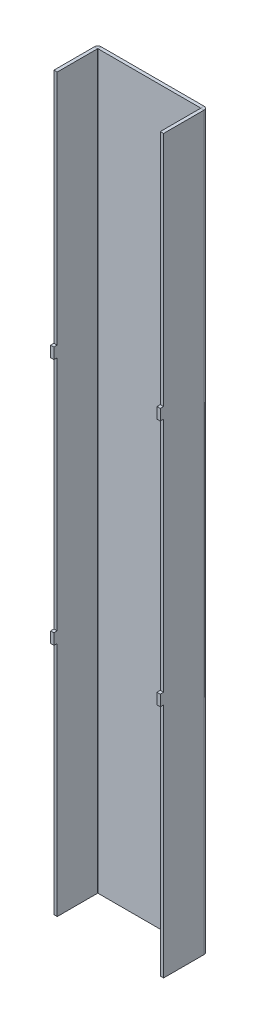
ISO-10303-21;
HEADER;
FILE_DESCRIPTION(('STEP AP214'),'2;1');
FILE_NAME('part.step','',(''),(''),'','','');
FILE_SCHEMA(('AUTOMOTIVE_DESIGN { 1 0 10303 214 1 1 1 1 }'));
ENDSEC;
DATA;
#1=APPLICATION_CONTEXT('core data for automotive mechanical design processes');
#2=APPLICATION_PROTOCOL_DEFINITION('international standard','automotive_design',2000,#1);
#3=PRODUCT_CONTEXT('',#1,'mechanical');
#4=PRODUCT('Part','Part','',(#3));
#5=PRODUCT_RELATED_PRODUCT_CATEGORY('part','',(#4));
#6=PRODUCT_DEFINITION_FORMATION('','',#4);
#7=PRODUCT_DEFINITION_CONTEXT('part definition',#1,'design');
#8=PRODUCT_DEFINITION('design','',#6,#7);
#9=PRODUCT_DEFINITION_SHAPE('','',#8);
#10=(LENGTH_UNIT() NAMED_UNIT(*) SI_UNIT(.MILLI.,.METRE.));
#11=(NAMED_UNIT(*) PLANE_ANGLE_UNIT() SI_UNIT($,.RADIAN.));
#12=(NAMED_UNIT(*) SI_UNIT($,.STERADIAN.) SOLID_ANGLE_UNIT());
#13=UNCERTAINTY_MEASURE_WITH_UNIT(LENGTH_MEASURE(1.E-05),#10,'distance_accuracy_value','');
#14=(GEOMETRIC_REPRESENTATION_CONTEXT(3) GLOBAL_UNCERTAINTY_ASSIGNED_CONTEXT((#13)) GLOBAL_UNIT_ASSIGNED_CONTEXT((#10,
#11,#12)) REPRESENTATION_CONTEXT('',''));
#15=CARTESIAN_POINT('',(0.,0.,0.));
#16=DIRECTION('',(0.,0.,1.));
#17=DIRECTION('',(1.,0.,0.));
#18=AXIS2_PLACEMENT_3D('',#15,#16,#17);
#19=CARTESIAN_POINT('',(533.936381184173,390.666666666667,48.5));
#20=DIRECTION('',(0.,1.,0.));
#21=DIRECTION('',(1.,0.,0.));
#22=AXIS2_PLACEMENT_3D('',#19,#20,#21);
#23=PLANE('',#22);
#24=DIRECTION('',(0.,0.,-1.));
#25=VECTOR('',#24,1.);
#26=CARTESIAN_POINT('',(-134.25,390.666666666667,48.5));
#27=LINE('',#26,#25);
#28=CARTESIAN_POINT('',(-134.25,390.666666666667,50.));
#29=VERTEX_POINT('',#28);
#30=CARTESIAN_POINT('',(-134.25,390.666666666667,48.4999999999999));
#31=VERTEX_POINT('',#30);
#32=EDGE_CURVE('E167',#29,#31,#27,.T.);
#33=ORIENTED_EDGE('',*,*,#32,.F.);
#34=DIRECTION('',(-1.,0.,0.));
#35=VECTOR('',#34,1.);
#36=CARTESIAN_POINT('',(533.936381184173,390.666666666667,50.));
#37=LINE('',#36,#35);
#38=CARTESIAN_POINT('',(-132.75,390.666666666667,50.));
#39=VERTEX_POINT('',#38);
#40=EDGE_CURVE('E605',#39,#29,#37,.T.);
#41=ORIENTED_EDGE('',*,*,#40,.F.);
#42=DIRECTION('',(0.,0.,-1.));
#43=VECTOR('',#42,1.);
#44=CARTESIAN_POINT('',(-132.75,390.666666666667,48.5));
#45=LINE('',#44,#43);
#46=CARTESIAN_POINT('',(-132.75,390.666666666667,48.4999999999999));
#47=VERTEX_POINT('',#46);
#48=EDGE_CURVE('E160',#39,#47,#45,.T.);
#49=ORIENTED_EDGE('',*,*,#48,.T.);
#50=DIRECTION('',(-1.,0.,0.));
#51=VECTOR('',#50,1.);
#52=CARTESIAN_POINT('',(533.936381184173,390.666666666667,48.5));
#53=LINE('',#52,#51);
#54=EDGE_CURVE('E611',#47,#31,#53,.T.);
#55=ORIENTED_EDGE('',*,*,#54,.T.);
#56=EDGE_LOOP('',(#33,#41,#49,#55));
#57=FACE_BOUND('',#56,.T.);
#58=ADVANCED_FACE('F53',(#57),#23,.T.);
#59=CARTESIAN_POINT('',(533.936381184173,390.666666666667,50.));
#60=DIRECTION('',(0.,0.,1.));
#61=DIRECTION('',(0.,-1.,0.));
#62=AXIS2_PLACEMENT_3D('',#59,#60,#61);
#63=PLANE('',#62);
#64=DIRECTION('',(0.,1.,0.));
#65=VECTOR('',#64,1.);
#66=CARTESIAN_POINT('',(-134.25,390.666666666667,50.));
#67=LINE('',#66,#65);
#68=CARTESIAN_POINT('',(-134.25,385.666666666667,50.));
#69=VERTEX_POINT('',#68);
#70=EDGE_CURVE('E519',#69,#29,#67,.T.);
#71=ORIENTED_EDGE('',*,*,#70,.F.);
#72=DIRECTION('',(-1.,0.,0.));
#73=VECTOR('',#72,1.);
#74=CARTESIAN_POINT('',(533.936381184173,385.666666666667,50.));
#75=LINE('',#74,#73);
#76=CARTESIAN_POINT('',(-132.75,385.666666666667,50.));
#77=VERTEX_POINT('',#76);
#78=EDGE_CURVE('E604',#77,#69,#75,.T.);
#79=ORIENTED_EDGE('',*,*,#78,.F.);
#80=DIRECTION('',(0.,1.,0.));
#81=VECTOR('',#80,1.);
#82=CARTESIAN_POINT('',(-132.75,390.666666666667,50.));
#83=LINE('',#82,#81);
#84=EDGE_CURVE('E607',#77,#39,#83,.T.);
#85=ORIENTED_EDGE('',*,*,#84,.T.);
#86=ORIENTED_EDGE('',*,*,#40,.T.);
#87=EDGE_LOOP('',(#71,#79,#85,#86));
#88=FACE_BOUND('',#87,.T.);
#89=ADVANCED_FACE('F820',(#88),#63,.T.);
#90=CARTESIAN_POINT('',(533.936381184173,385.666666666667,48.5));
#91=DIRECTION('',(0.,-1.,0.));
#92=DIRECTION('',(-1.,0.,0.));
#93=AXIS2_PLACEMENT_3D('',#90,#91,#92);
#94=PLANE('',#93);
#95=DIRECTION('',(0.,0.,1.));
#96=VECTOR('',#95,1.);
#97=CARTESIAN_POINT('',(-134.25,385.666666666667,48.5));
#98=LINE('',#97,#96);
#99=CARTESIAN_POINT('',(-134.25,385.666666666667,48.4999999999999));
#100=VERTEX_POINT('',#99);
#101=EDGE_CURVE('E515',#100,#69,#98,.T.);
#102=ORIENTED_EDGE('',*,*,#101,.F.);
#103=DIRECTION('',(-1.,0.,0.));
#104=VECTOR('',#103,1.);
#105=CARTESIAN_POINT('',(533.936381184173,385.666666666667,48.5));
#106=LINE('',#105,#104);
#107=CARTESIAN_POINT('',(-132.75,385.666666666667,48.4999999999999));
#108=VERTEX_POINT('',#107);
#109=EDGE_CURVE('E579',#108,#100,#106,.T.);
#110=ORIENTED_EDGE('',*,*,#109,.F.);
#111=DIRECTION('',(0.,0.,1.));
#112=VECTOR('',#111,1.);
#113=CARTESIAN_POINT('',(-132.75,385.666666666667,48.5));
#114=LINE('',#113,#112);
#115=EDGE_CURVE('E600',#108,#77,#114,.T.);
#116=ORIENTED_EDGE('',*,*,#115,.T.);
#117=ORIENTED_EDGE('',*,*,#78,.T.);
#118=EDGE_LOOP('',(#102,#110,#116,#117));
#119=FACE_BOUND('',#118,.T.);
#120=ADVANCED_FACE('F825',(#119),#94,.T.);
#121=CARTESIAN_POINT('',(533.936381184173,400.,48.5));
#122=DIRECTION('',(0.,0.,-1.));
#123=DIRECTION('',(0.,1.,0.));
#124=AXIS2_PLACEMENT_3D('',#121,#122,#123);
#125=PLANE('',#124);
#126=ORIENTED_EDGE('',*,*,#109,.T.);
#127=DIRECTION('',(0.,1.,0.));
#128=VECTOR('',#127,1.);
#129=CARTESIAN_POINT('',(-134.25,400.,48.5));
#130=LINE('',#129,#128);
#131=CARTESIAN_POINT('',(-134.25,277.833333333333,48.4999999999999));
#132=VERTEX_POINT('',#131);
#133=EDGE_CURVE('E504',#132,#100,#130,.T.);
#134=ORIENTED_EDGE('',*,*,#133,.F.);
#135=DIRECTION('',(-1.,0.,0.));
#136=VECTOR('',#135,1.);
#137=CARTESIAN_POINT('',(533.936381184173,277.833333333333,48.5));
#138=LINE('',#137,#136);
#139=CARTESIAN_POINT('',(-132.75,277.833333333333,48.4999999999999));
#140=VERTEX_POINT('',#139);
#141=EDGE_CURVE('E577',#140,#132,#138,.T.);
#142=ORIENTED_EDGE('',*,*,#141,.F.);
#143=DIRECTION('',(0.,1.,0.));
#144=VECTOR('',#143,1.);
#145=CARTESIAN_POINT('',(-132.75,400.,48.5));
#146=LINE('',#145,#144);
#147=EDGE_CURVE('E65',#108,#140,#146,.F.);
#148=ORIENTED_EDGE('',*,*,#147,.F.);
#149=EDGE_LOOP('',(#126,#134,#142,#148));
#150=FACE_BOUND('',#149,.T.);
#151=ADVANCED_FACE('F576',(#150),#125,.F.);
#152=CARTESIAN_POINT('',(533.936381184173,277.833333333333,48.5));
#153=DIRECTION('',(0.,1.,0.));
#154=DIRECTION('',(1.,0.,0.));
#155=AXIS2_PLACEMENT_3D('',#152,#153,#154);
#156=PLANE('',#155);
#157=DIRECTION('',(0.,0.,-1.));
#158=VECTOR('',#157,1.);
#159=CARTESIAN_POINT('',(-134.25,277.833333333333,48.5));
#160=LINE('',#159,#158);
#161=CARTESIAN_POINT('',(-134.25,277.833333333333,50.));
#162=VERTEX_POINT('',#161);
#163=EDGE_CURVE('E566',#162,#132,#160,.T.);
#164=ORIENTED_EDGE('',*,*,#163,.F.);
#165=DIRECTION('',(-1.,0.,0.));
#166=VECTOR('',#165,1.);
#167=CARTESIAN_POINT('',(533.936381184173,277.833333333333,50.));
#168=LINE('',#167,#166);
#169=CARTESIAN_POINT('',(-132.75,277.833333333333,50.));
#170=VERTEX_POINT('',#169);
#171=EDGE_CURVE('E399',#170,#162,#168,.T.);
#172=ORIENTED_EDGE('',*,*,#171,.F.);
#173=DIRECTION('',(0.,0.,-1.));
#174=VECTOR('',#173,1.);
#175=CARTESIAN_POINT('',(-132.75,277.833333333333,48.5));
#176=LINE('',#175,#174);
#177=EDGE_CURVE('E584',#170,#140,#176,.T.);
#178=ORIENTED_EDGE('',*,*,#177,.T.);
#179=ORIENTED_EDGE('',*,*,#141,.T.);
#180=EDGE_LOOP('',(#164,#172,#178,#179));
#181=FACE_BOUND('',#180,.T.);
#182=ADVANCED_FACE('F581',(#181),#156,.T.);
#183=CARTESIAN_POINT('',(533.936381184173,277.833333333333,50.));
#184=DIRECTION('',(0.,0.,1.));
#185=DIRECTION('',(0.,-1.,0.));
#186=AXIS2_PLACEMENT_3D('',#183,#184,#185);
#187=PLANE('',#186);
#188=DIRECTION('',(0.,1.,0.));
#189=VECTOR('',#188,1.);
#190=CARTESIAN_POINT('',(-134.25,277.833333333333,50.));
#191=LINE('',#190,#189);
#192=CARTESIAN_POINT('',(-134.25,272.833333333333,50.));
#193=VERTEX_POINT('',#192);
#194=EDGE_CURVE('E562',#193,#162,#191,.T.);
#195=ORIENTED_EDGE('',*,*,#194,.F.);
#196=DIRECTION('',(-1.,0.,0.));
#197=VECTOR('',#196,1.);
#198=CARTESIAN_POINT('',(533.936381184173,272.833333333333,50.));
#199=LINE('',#198,#197);
#200=CARTESIAN_POINT('',(-132.75,272.833333333333,50.));
#201=VERTEX_POINT('',#200);
#202=EDGE_CURVE('E391',#201,#193,#199,.T.);
#203=ORIENTED_EDGE('',*,*,#202,.F.);
#204=DIRECTION('',(0.,1.,0.));
#205=VECTOR('',#204,1.);
#206=CARTESIAN_POINT('',(-132.75,277.833333333333,50.));
#207=LINE('',#206,#205);
#208=EDGE_CURVE('E586',#201,#170,#207,.T.);
#209=ORIENTED_EDGE('',*,*,#208,.T.);
#210=ORIENTED_EDGE('',*,*,#171,.T.);
#211=EDGE_LOOP('',(#195,#203,#209,#210));
#212=FACE_BOUND('',#211,.T.);
#213=ADVANCED_FACE('F843',(#212),#187,.T.);
#214=CARTESIAN_POINT('',(533.936381184173,272.833333333333,48.5));
#215=DIRECTION('',(0.,-1.,0.));
#216=DIRECTION('',(-1.,0.,0.));
#217=AXIS2_PLACEMENT_3D('',#214,#215,#216);
#218=PLANE('',#217);
#219=DIRECTION('',(0.,0.,1.));
#220=VECTOR('',#219,1.);
#221=CARTESIAN_POINT('',(-134.25,272.833333333333,48.5));
#222=LINE('',#221,#220);
#223=CARTESIAN_POINT('',(-134.25,272.833333333333,48.4999999999999));
#224=VERTEX_POINT('',#223);
#225=EDGE_CURVE('E498',#224,#193,#222,.T.);
#226=ORIENTED_EDGE('',*,*,#225,.F.);
#227=DIRECTION('',(-1.,0.,0.));
#228=VECTOR('',#227,1.);
#229=CARTESIAN_POINT('',(533.936381184173,272.833333333333,48.5));
#230=LINE('',#229,#228);
#231=CARTESIAN_POINT('',(-132.75,272.833333333333,48.4999999999999));
#232=VERTEX_POINT('',#231);
#233=EDGE_CURVE('E384',#232,#224,#230,.T.);
#234=ORIENTED_EDGE('',*,*,#233,.F.);
#235=DIRECTION('',(0.,0.,1.));
#236=VECTOR('',#235,1.);
#237=CARTESIAN_POINT('',(-132.75,272.833333333333,48.5));
#238=LINE('',#237,#236);
#239=EDGE_CURVE('E395',#232,#201,#238,.T.);
#240=ORIENTED_EDGE('',*,*,#239,.T.);
#241=ORIENTED_EDGE('',*,*,#202,.T.);
#242=EDGE_LOOP('',(#226,#234,#240,#241));
#243=FACE_BOUND('',#242,.T.);
#244=ADVANCED_FACE('F839',(#243),#218,.T.);
#245=ORIENTED_EDGE('',*,*,#233,.T.);
#246=CARTESIAN_POINT('',(-134.25,165.,48.5));
#247=VERTEX_POINT('',#246);
#248=EDGE_CURVE('E350',#247,#224,#130,.T.);
#249=ORIENTED_EDGE('',*,*,#248,.F.);
#250=DIRECTION('',(-1.,0.,0.));
#251=VECTOR('',#250,1.);
#252=CARTESIAN_POINT('',(533.936381184173,165.,48.5));
#253=LINE('',#252,#251);
#254=CARTESIAN_POINT('',(-132.75,165.,48.5));
#255=VERTEX_POINT('',#254);
#256=EDGE_CURVE('E79',#255,#247,#253,.T.);
#257=ORIENTED_EDGE('',*,*,#256,.F.);
#258=EDGE_CURVE('E12',#232,#255,#146,.F.);
#259=ORIENTED_EDGE('',*,*,#258,.F.);
#260=EDGE_LOOP('',(#245,#249,#257,#259));
#261=FACE_BOUND('',#260,.T.);
#262=ADVANCED_FACE('F835',(#261),#125,.F.);
#263=DIRECTION('',(-1.,0.,0.));
#264=VECTOR('',#263,1.);
#265=CARTESIAN_POINT('',(533.936381184173,498.5,48.5));
#266=LINE('',#265,#264);
#267=CARTESIAN_POINT('',(-132.75,498.5,48.5));
#268=VERTEX_POINT('',#267);
#269=CARTESIAN_POINT('',(-134.25,498.5,48.5));
#270=VERTEX_POINT('',#269);
#271=EDGE_CURVE('E379',#268,#270,#266,.T.);
#272=ORIENTED_EDGE('',*,*,#271,.T.);
#273=EDGE_CURVE('E377',#31,#270,#130,.T.);
#274=ORIENTED_EDGE('',*,*,#273,.F.);
#275=ORIENTED_EDGE('',*,*,#54,.F.);
#276=EDGE_CURVE('E67',#268,#47,#146,.F.);
#277=ORIENTED_EDGE('',*,*,#276,.F.);
#278=EDGE_LOOP('',(#272,#274,#275,#277));
#279=FACE_BOUND('',#278,.T.);
#280=ADVANCED_FACE('F838',(#279),#125,.F.);
#281=CARTESIAN_POINT('',(533.936381184173,498.5,50.));
#282=DIRECTION('',(0.,1.,0.));
#283=DIRECTION('',(1.,0.,0.));
#284=AXIS2_PLACEMENT_3D('',#281,#282,#283);
#285=PLANE('',#284);
#286=DIRECTION('',(0.,0.,-1.));
#287=VECTOR('',#286,1.);
#288=CARTESIAN_POINT('',(-134.25,498.5,50.));
#289=LINE('',#288,#287);
#290=CARTESIAN_POINT('',(-134.25,498.5,30.1));
#291=VERTEX_POINT('',#290);
#292=EDGE_CURVE('E367',#291,#270,#289,.F.);
#293=ORIENTED_EDGE('',*,*,#292,.T.);
#294=ORIENTED_EDGE('',*,*,#271,.F.);
#295=DIRECTION('',(0.,0.,-1.));
#296=VECTOR('',#295,1.);
#297=CARTESIAN_POINT('',(-132.75,498.5,50.));
#298=LINE('',#297,#296);
#299=CARTESIAN_POINT('',(-132.75,498.5,30.1000000000001));
#300=VERTEX_POINT('',#299);
#301=EDGE_CURVE('E370',#268,#300,#298,.T.);
#302=ORIENTED_EDGE('',*,*,#301,.T.);
#303=DIRECTION('',(-1.,0.,0.));
#304=VECTOR('',#303,1.);
#305=CARTESIAN_POINT('',(533.936381184173,498.5,30.1000000000001));
#306=LINE('',#305,#304);
#307=EDGE_CURVE('E351',#300,#291,#306,.T.);
#308=ORIENTED_EDGE('',*,*,#307,.T.);
#309=EDGE_LOOP('',(#293,#294,#302,#308));
#310=FACE_BOUND('',#309,.T.);
#311=ADVANCED_FACE('F365',(#310),#285,.T.);
#312=CARTESIAN_POINT('',(-134.25,552.351648071345,48.5000000000002));
#313=DIRECTION('',(1.,0.,0.));
#314=DIRECTION('',(0.,0.,-1.));
#315=AXIS2_PLACEMENT_3D('',#312,#313,#314);
#316=PLANE('',#315);
#317=ORIENTED_EDGE('',*,*,#292,.F.);
#318=DIRECTION('',(0.,-1.,0.));
#319=VECTOR('',#318,1.);
#320=CARTESIAN_POINT('',(-134.25,498.5,30.1000000000001));
#321=LINE('',#320,#319);
#322=CARTESIAN_POINT('',(-134.25,165.,30.0999999999999));
#323=VERTEX_POINT('',#322);
#324=EDGE_CURVE('E338',#291,#323,#321,.T.);
#325=ORIENTED_EDGE('',*,*,#324,.T.);
#326=DIRECTION('',(0.,0.,-1.));
#327=VECTOR('',#326,1.);
#328=CARTESIAN_POINT('',(-134.25,165.,48.5000000000002));
#329=LINE('',#328,#327);
#330=EDGE_CURVE('E487',#247,#323,#329,.T.);
#331=ORIENTED_EDGE('',*,*,#330,.F.);
#332=ORIENTED_EDGE('',*,*,#248,.T.);
#333=ORIENTED_EDGE('',*,*,#225,.T.);
#334=ORIENTED_EDGE('',*,*,#194,.T.);
#335=ORIENTED_EDGE('',*,*,#163,.T.);
#336=ORIENTED_EDGE('',*,*,#133,.T.);
#337=ORIENTED_EDGE('',*,*,#101,.T.);
#338=ORIENTED_EDGE('',*,*,#70,.T.);
#339=ORIENTED_EDGE('',*,*,#32,.T.);
#340=ORIENTED_EDGE('',*,*,#273,.T.);
#341=EDGE_LOOP('',(#317,#325,#331,#332,#333,#334,#335,#336,#337,#338,#339,#340));
#342=FACE_BOUND('',#341,.T.);
#343=ADVANCED_FACE('F376',(#342),#316,.F.);
#344=CARTESIAN_POINT('',(533.936381184173,165.,48.5));
#345=DIRECTION('',(0.,-1.,0.));
#346=DIRECTION('',(0.,0.,-1.));
#347=AXIS2_PLACEMENT_3D('',#344,#345,#346);
#348=PLANE('',#347);
#349=ORIENTED_EDGE('',*,*,#330,.T.);
#350=DIRECTION('',(-1.,0.,0.));
#351=VECTOR('',#350,1.);
#352=CARTESIAN_POINT('',(533.936381184173,165.,30.0999999999999));
#353=LINE('',#352,#351);
#354=CARTESIAN_POINT('',(-132.75,165.,30.0999999999999));
#355=VERTEX_POINT('',#354);
#356=EDGE_CURVE('E58',#355,#323,#353,.T.);
#357=ORIENTED_EDGE('',*,*,#356,.F.);
#358=DIRECTION('',(0.,0.,-1.));
#359=VECTOR('',#358,1.);
#360=CARTESIAN_POINT('',(-132.75,165.,48.5));
#361=LINE('',#360,#359);
#362=EDGE_CURVE('E529',#255,#355,#361,.T.);
#363=ORIENTED_EDGE('',*,*,#362,.F.);
#364=ORIENTED_EDGE('',*,*,#256,.T.);
#365=EDGE_LOOP('',(#349,#357,#363,#364));
#366=FACE_BOUND('',#365,.T.);
#367=ADVANCED_FACE('F854',(#366),#348,.T.);
#368=CARTESIAN_POINT('',(-132.75,552.351648071345,48.5000000000002));
#369=DIRECTION('',(-1.,0.,0.));
#370=DIRECTION('',(0.,-1.,0.));
#371=AXIS2_PLACEMENT_3D('',#368,#369,#370);
#372=PLANE('',#371);
#373=ORIENTED_EDGE('',*,*,#362,.T.);
#374=DIRECTION('',(0.,1.,0.));
#375=VECTOR('',#374,1.);
#376=CARTESIAN_POINT('',(-132.75,498.5,30.1000000000001));
#377=LINE('',#376,#375);
#378=EDGE_CURVE('E533',#355,#300,#377,.T.);
#379=ORIENTED_EDGE('',*,*,#378,.T.);
#380=ORIENTED_EDGE('',*,*,#301,.F.);
#381=ORIENTED_EDGE('',*,*,#276,.T.);
#382=ORIENTED_EDGE('',*,*,#48,.F.);
#383=ORIENTED_EDGE('',*,*,#84,.F.);
#384=ORIENTED_EDGE('',*,*,#115,.F.);
#385=ORIENTED_EDGE('',*,*,#147,.T.);
#386=ORIENTED_EDGE('',*,*,#177,.F.);
#387=ORIENTED_EDGE('',*,*,#208,.F.);
#388=ORIENTED_EDGE('',*,*,#239,.F.);
#389=ORIENTED_EDGE('',*,*,#258,.T.);
#390=EDGE_LOOP('',(#373,#379,#380,#381,#382,#383,#384,#385,#386,#387,#388,#389));
#391=FACE_BOUND('',#390,.T.);
#392=ADVANCED_FACE('F56',(#391),#372,.F.);
#393=CARTESIAN_POINT('',(-752.436381184173,272.833333333333,48.5));
#394=DIRECTION('',(0.,-1.,0.));
#395=DIRECTION('',(0.,0.,1.));
#396=AXIS2_PLACEMENT_3D('',#393,#394,#395);
#397=PLANE('',#396);
#398=DIRECTION('',(0.,0.,-1.));
#399=VECTOR('',#398,1.);
#400=CARTESIAN_POINT('',(-84.25,272.833333333333,48.5));
#401=LINE('',#400,#399);
#402=CARTESIAN_POINT('',(-84.25,272.833333333333,50.));
#403=VERTEX_POINT('',#402);
#404=CARTESIAN_POINT('',(-84.25,272.833333333333,48.5));
#405=VERTEX_POINT('',#404);
#406=EDGE_CURVE('E267',#403,#405,#401,.T.);
#407=ORIENTED_EDGE('',*,*,#406,.F.);
#408=DIRECTION('',(1.,0.,0.));
#409=VECTOR('',#408,1.);
#410=CARTESIAN_POINT('',(-752.436381184173,272.833333333333,50.));
#411=LINE('',#410,#409);
#412=CARTESIAN_POINT('',(-85.75,272.833333333333,50.));
#413=VERTEX_POINT('',#412);
#414=EDGE_CURVE('E712',#413,#403,#411,.T.);
#415=ORIENTED_EDGE('',*,*,#414,.F.);
#416=DIRECTION('',(0.,0.,-1.));
#417=VECTOR('',#416,1.);
#418=CARTESIAN_POINT('',(-85.7500000000001,272.833333333333,48.5));
#419=LINE('',#418,#417);
#420=CARTESIAN_POINT('',(-85.75,272.833333333333,48.5));
#421=VERTEX_POINT('',#420);
#422=EDGE_CURVE('E261',#413,#421,#419,.T.);
#423=ORIENTED_EDGE('',*,*,#422,.T.);
#424=DIRECTION('',(1.,0.,0.));
#425=VECTOR('',#424,1.);
#426=CARTESIAN_POINT('',(-752.436381184173,272.833333333333,48.5));
#427=LINE('',#426,#425);
#428=EDGE_CURVE('E719',#421,#405,#427,.T.);
#429=ORIENTED_EDGE('',*,*,#428,.T.);
#430=EDGE_LOOP('',(#407,#415,#423,#429));
#431=FACE_BOUND('',#430,.T.);
#432=ADVANCED_FACE('F859',(#431),#397,.T.);
#433=CARTESIAN_POINT('',(-752.436381184173,272.833333333333,50.));
#434=DIRECTION('',(0.,0.,1.));
#435=DIRECTION('',(0.,1.,0.));
#436=AXIS2_PLACEMENT_3D('',#433,#434,#435);
#437=PLANE('',#436);
#438=DIRECTION('',(0.,-1.,0.));
#439=VECTOR('',#438,1.);
#440=CARTESIAN_POINT('',(-84.25,272.833333333333,50.));
#441=LINE('',#440,#439);
#442=CARTESIAN_POINT('',(-84.25,277.833333333333,50.));
#443=VERTEX_POINT('',#442);
#444=EDGE_CURVE('E624',#443,#403,#441,.T.);
#445=ORIENTED_EDGE('',*,*,#444,.F.);
#446=DIRECTION('',(1.,0.,0.));
#447=VECTOR('',#446,1.);
#448=CARTESIAN_POINT('',(-752.436381184173,277.833333333333,50.));
#449=LINE('',#448,#447);
#450=CARTESIAN_POINT('',(-85.75,277.833333333333,50.));
#451=VERTEX_POINT('',#450);
#452=EDGE_CURVE('E705',#451,#443,#449,.T.);
#453=ORIENTED_EDGE('',*,*,#452,.F.);
#454=DIRECTION('',(0.,-1.,0.));
#455=VECTOR('',#454,1.);
#456=CARTESIAN_POINT('',(-85.7500000000001,272.833333333333,50.));
#457=LINE('',#456,#455);
#458=EDGE_CURVE('E715',#451,#413,#457,.T.);
#459=ORIENTED_EDGE('',*,*,#458,.T.);
#460=ORIENTED_EDGE('',*,*,#414,.T.);
#461=EDGE_LOOP('',(#445,#453,#459,#460));
#462=FACE_BOUND('',#461,.T.);
#463=ADVANCED_FACE('F883',(#462),#437,.T.);
#464=CARTESIAN_POINT('',(-752.436381184173,277.833333333333,48.5));
#465=DIRECTION('',(0.,1.,0.));
#466=DIRECTION('',(0.,0.,-1.));
#467=AXIS2_PLACEMENT_3D('',#464,#465,#466);
#468=PLANE('',#467);
#469=DIRECTION('',(0.,0.,1.));
#470=VECTOR('',#469,1.);
#471=CARTESIAN_POINT('',(-84.25,277.833333333333,48.5));
#472=LINE('',#471,#470);
#473=CARTESIAN_POINT('',(-84.2500000000001,277.833333333333,48.5));
#474=VERTEX_POINT('',#473);
#475=EDGE_CURVE('E630',#474,#443,#472,.T.);
#476=ORIENTED_EDGE('',*,*,#475,.F.);
#477=DIRECTION('',(1.,0.,0.));
#478=VECTOR('',#477,1.);
#479=CARTESIAN_POINT('',(-752.436381184173,277.833333333333,48.5));
#480=LINE('',#479,#478);
#481=CARTESIAN_POINT('',(-85.7500000000001,277.833333333333,48.5));
#482=VERTEX_POINT('',#481);
#483=EDGE_CURVE('E701',#482,#474,#480,.T.);
#484=ORIENTED_EDGE('',*,*,#483,.F.);
#485=DIRECTION('',(0.,0.,1.));
#486=VECTOR('',#485,1.);
#487=CARTESIAN_POINT('',(-85.7500000000001,277.833333333333,48.5));
#488=LINE('',#487,#486);
#489=EDGE_CURVE('E708',#482,#451,#488,.T.);
#490=ORIENTED_EDGE('',*,*,#489,.T.);
#491=ORIENTED_EDGE('',*,*,#452,.T.);
#492=EDGE_LOOP('',(#476,#484,#490,#491));
#493=FACE_BOUND('',#492,.T.);
#494=ADVANCED_FACE('F800',(#493),#468,.T.);
#495=CARTESIAN_POINT('',(-752.436381184173,400.,48.5));
#496=DIRECTION('',(0.,0.,-1.));
#497=DIRECTION('',(0.,-1.,0.));
#498=AXIS2_PLACEMENT_3D('',#495,#496,#497);
#499=PLANE('',#498);
#500=ORIENTED_EDGE('',*,*,#483,.T.);
#501=DIRECTION('',(0.,1.,0.));
#502=VECTOR('',#501,1.);
#503=CARTESIAN_POINT('',(-84.2499999999999,400.,48.5));
#504=LINE('',#503,#502);
#505=CARTESIAN_POINT('',(-84.2500000000001,385.666666666667,48.5));
#506=VERTEX_POINT('',#505);
#507=EDGE_CURVE('E635',#506,#474,#504,.F.);
#508=ORIENTED_EDGE('',*,*,#507,.F.);
#509=DIRECTION('',(1.,0.,0.));
#510=VECTOR('',#509,1.);
#511=CARTESIAN_POINT('',(-752.436381184173,385.666666666666,48.5));
#512=LINE('',#511,#510);
#513=CARTESIAN_POINT('',(-85.75,385.666666666667,48.5));
#514=VERTEX_POINT('',#513);
#515=EDGE_CURVE('E700',#514,#506,#512,.T.);
#516=ORIENTED_EDGE('',*,*,#515,.F.);
#517=DIRECTION('',(0.,1.,0.));
#518=VECTOR('',#517,1.);
#519=CARTESIAN_POINT('',(-85.75,400.,48.5));
#520=LINE('',#519,#518);
#521=EDGE_CURVE('E684',#482,#514,#520,.T.);
#522=ORIENTED_EDGE('',*,*,#521,.F.);
#523=EDGE_LOOP('',(#500,#508,#516,#522));
#524=FACE_BOUND('',#523,.T.);
#525=ADVANCED_FACE('F797',(#524),#499,.F.);
#526=CARTESIAN_POINT('',(-752.436381184173,385.666666666666,48.5));
#527=DIRECTION('',(0.,-1.,0.));
#528=DIRECTION('',(0.,0.,1.));
#529=AXIS2_PLACEMENT_3D('',#526,#527,#528);
#530=PLANE('',#529);
#531=DIRECTION('',(0.,0.,-1.));
#532=VECTOR('',#531,1.);
#533=CARTESIAN_POINT('',(-84.25,385.666666666667,48.5));
#534=LINE('',#533,#532);
#535=CARTESIAN_POINT('',(-84.2500000000001,385.666666666667,50.));
#536=VERTEX_POINT('',#535);
#537=EDGE_CURVE('E636',#536,#506,#534,.T.);
#538=ORIENTED_EDGE('',*,*,#537,.F.);
#539=DIRECTION('',(1.,0.,0.));
#540=VECTOR('',#539,1.);
#541=CARTESIAN_POINT('',(-752.436381184173,385.666666666666,50.));
#542=LINE('',#541,#540);
#543=CARTESIAN_POINT('',(-85.75,385.666666666667,50.));
#544=VERTEX_POINT('',#543);
#545=EDGE_CURVE('E657',#544,#536,#542,.T.);
#546=ORIENTED_EDGE('',*,*,#545,.F.);
#547=DIRECTION('',(0.,0.,-1.));
#548=VECTOR('',#547,1.);
#549=CARTESIAN_POINT('',(-85.7500000000002,385.666666666667,48.5));
#550=LINE('',#549,#548);
#551=EDGE_CURVE('E695',#544,#514,#550,.T.);
#552=ORIENTED_EDGE('',*,*,#551,.T.);
#553=ORIENTED_EDGE('',*,*,#515,.T.);
#554=EDGE_LOOP('',(#538,#546,#552,#553));
#555=FACE_BOUND('',#554,.T.);
#556=ADVANCED_FACE('F803',(#555),#530,.T.);
#557=CARTESIAN_POINT('',(-752.436381184173,385.666666666666,50.));
#558=DIRECTION('',(0.,0.,1.));
#559=DIRECTION('',(0.,1.,0.));
#560=AXIS2_PLACEMENT_3D('',#557,#558,#559);
#561=PLANE('',#560);
#562=DIRECTION('',(0.,-1.,0.));
#563=VECTOR('',#562,1.);
#564=CARTESIAN_POINT('',(-84.25,385.666666666667,50.));
#565=LINE('',#564,#563);
#566=CARTESIAN_POINT('',(-84.2500000000001,390.666666666667,50.));
#567=VERTEX_POINT('',#566);
#568=EDGE_CURVE('E439',#567,#536,#565,.T.);
#569=ORIENTED_EDGE('',*,*,#568,.F.);
#570=DIRECTION('',(1.,0.,0.));
#571=VECTOR('',#570,1.);
#572=CARTESIAN_POINT('',(-752.436381184173,390.666666666666,50.));
#573=LINE('',#572,#571);
#574=CARTESIAN_POINT('',(-85.75,390.666666666667,50.));
#575=VERTEX_POINT('',#574);
#576=EDGE_CURVE('E654',#575,#567,#573,.T.);
#577=ORIENTED_EDGE('',*,*,#576,.F.);
#578=DIRECTION('',(0.,-1.,0.));
#579=VECTOR('',#578,1.);
#580=CARTESIAN_POINT('',(-85.7500000000002,385.666666666667,50.));
#581=LINE('',#580,#579);
#582=EDGE_CURVE('E805',#575,#544,#581,.T.);
#583=ORIENTED_EDGE('',*,*,#582,.T.);
#584=ORIENTED_EDGE('',*,*,#545,.T.);
#585=EDGE_LOOP('',(#569,#577,#583,#584));
#586=FACE_BOUND('',#585,.T.);
#587=ADVANCED_FACE('F653',(#586),#561,.T.);
#588=CARTESIAN_POINT('',(-752.436381184173,390.666666666666,48.5));
#589=DIRECTION('',(0.,1.,0.));
#590=DIRECTION('',(0.,0.,-1.));
#591=AXIS2_PLACEMENT_3D('',#588,#589,#590);
#592=PLANE('',#591);
#593=DIRECTION('',(0.,0.,1.));
#594=VECTOR('',#593,1.);
#595=CARTESIAN_POINT('',(-84.25,390.666666666667,48.5));
#596=LINE('',#595,#594);
#597=CARTESIAN_POINT('',(-84.2500000000001,390.666666666667,48.5));
#598=VERTEX_POINT('',#597);
#599=EDGE_CURVE('E434',#598,#567,#596,.T.);
#600=ORIENTED_EDGE('',*,*,#599,.F.);
#601=DIRECTION('',(1.,0.,0.));
#602=VECTOR('',#601,1.);
#603=CARTESIAN_POINT('',(-752.436381184173,390.666666666666,48.5));
#604=LINE('',#603,#602);
#605=CARTESIAN_POINT('',(-85.75,390.666666666667,48.5));
#606=VERTEX_POINT('',#605);
#607=EDGE_CURVE('E665',#606,#598,#604,.T.);
#608=ORIENTED_EDGE('',*,*,#607,.F.);
#609=DIRECTION('',(0.,0.,1.));
#610=VECTOR('',#609,1.);
#611=CARTESIAN_POINT('',(-85.7500000000002,390.666666666667,48.5));
#612=LINE('',#611,#610);
#613=EDGE_CURVE('E663',#606,#575,#612,.T.);
#614=ORIENTED_EDGE('',*,*,#613,.T.);
#615=ORIENTED_EDGE('',*,*,#576,.T.);
#616=EDGE_LOOP('',(#600,#608,#614,#615));
#617=FACE_BOUND('',#616,.T.);
#618=ADVANCED_FACE('F659',(#617),#592,.T.);
#619=ORIENTED_EDGE('',*,*,#607,.T.);
#620=CARTESIAN_POINT('',(-84.2499999999999,498.5,48.5));
#621=VERTEX_POINT('',#620);
#622=EDGE_CURVE('E440',#621,#598,#504,.F.);
#623=ORIENTED_EDGE('',*,*,#622,.F.);
#624=DIRECTION('',(1.,0.,0.));
#625=VECTOR('',#624,1.);
#626=CARTESIAN_POINT('',(-752.436381184173,498.5,48.5000000000001));
#627=LINE('',#626,#625);
#628=CARTESIAN_POINT('',(-85.7500000000001,498.5,48.5000000000001));
#629=VERTEX_POINT('',#628);
#630=EDGE_CURVE('E180',#629,#621,#627,.T.);
#631=ORIENTED_EDGE('',*,*,#630,.F.);
#632=EDGE_CURVE('E685',#606,#629,#520,.T.);
#633=ORIENTED_EDGE('',*,*,#632,.F.);
#634=EDGE_LOOP('',(#619,#623,#631,#633));
#635=FACE_BOUND('',#634,.T.);
#636=ADVANCED_FACE('F817',(#635),#499,.F.);
#637=DIRECTION('',(1.,0.,0.));
#638=VECTOR('',#637,1.);
#639=CARTESIAN_POINT('',(-752.436381184173,165.,48.5));
#640=LINE('',#639,#638);
#641=CARTESIAN_POINT('',(-85.75,165.,48.5));
#642=VERTEX_POINT('',#641);
#643=CARTESIAN_POINT('',(-84.25,165.,48.5));
#644=VERTEX_POINT('',#643);
#645=EDGE_CURVE('E669',#642,#644,#640,.T.);
#646=ORIENTED_EDGE('',*,*,#645,.T.);
#647=EDGE_CURVE('E423',#405,#644,#504,.F.);
#648=ORIENTED_EDGE('',*,*,#647,.F.);
#649=ORIENTED_EDGE('',*,*,#428,.F.);
#650=EDGE_CURVE('E680',#642,#421,#520,.T.);
#651=ORIENTED_EDGE('',*,*,#650,.F.);
#652=EDGE_LOOP('',(#646,#648,#649,#651));
#653=FACE_BOUND('',#652,.T.);
#654=ADVANCED_FACE('F818',(#653),#499,.F.);
#655=CARTESIAN_POINT('',(-752.436381184173,165.,48.5000000000002));
#656=DIRECTION('',(0.,-1.,0.));
#657=DIRECTION('',(0.,0.,1.));
#658=AXIS2_PLACEMENT_3D('',#655,#656,#657);
#659=PLANE('',#658);
#660=DIRECTION('',(0.,0.,1.));
#661=VECTOR('',#660,1.);
#662=CARTESIAN_POINT('',(-84.25,165.,48.5));
#663=LINE('',#662,#661);
#664=CARTESIAN_POINT('',(-84.25,165.,30.0999999999998));
#665=VERTEX_POINT('',#664);
#666=EDGE_CURVE('E779',#665,#644,#663,.T.);
#667=ORIENTED_EDGE('',*,*,#666,.T.);
#668=ORIENTED_EDGE('',*,*,#645,.F.);
#669=DIRECTION('',(0.,0.,1.));
#670=VECTOR('',#669,1.);
#671=CARTESIAN_POINT('',(-85.75,165.,48.5000000000002));
#672=LINE('',#671,#670);
#673=CARTESIAN_POINT('',(-85.75,165.,30.0999999999998));
#674=VERTEX_POINT('',#673);
#675=EDGE_CURVE('E905',#642,#674,#672,.F.);
#676=ORIENTED_EDGE('',*,*,#675,.T.);
#677=DIRECTION('',(1.,0.,0.));
#678=VECTOR('',#677,1.);
#679=CARTESIAN_POINT('',(-752.436381184173,165.,30.0999999999998));
#680=LINE('',#679,#678);
#681=EDGE_CURVE('E448',#674,#665,#680,.T.);
#682=ORIENTED_EDGE('',*,*,#681,.T.);
#683=EDGE_LOOP('',(#667,#668,#676,#682));
#684=FACE_BOUND('',#683,.T.);
#685=ADVANCED_FACE('F900',(#684),#659,.T.);
#686=CARTESIAN_POINT('',(-84.2500000000001,552.351648071345,48.5000000000002));
#687=DIRECTION('',(-1.,0.,0.));
#688=DIRECTION('',(0.,0.,1.));
#689=AXIS2_PLACEMENT_3D('',#686,#687,#688);
#690=PLANE('',#689);
#691=ORIENTED_EDGE('',*,*,#666,.F.);
#692=DIRECTION('',(0.,1.,0.));
#693=VECTOR('',#692,1.);
#694=CARTESIAN_POINT('',(-84.25,165.,30.0999999999998));
#695=LINE('',#694,#693);
#696=CARTESIAN_POINT('',(-84.2500000000001,498.5,30.1));
#697=VERTEX_POINT('',#696);
#698=EDGE_CURVE('E443',#665,#697,#695,.T.);
#699=ORIENTED_EDGE('',*,*,#698,.T.);
#700=DIRECTION('',(0.,0.,-1.));
#701=VECTOR('',#700,1.);
#702=CARTESIAN_POINT('',(-84.2499999999999,498.5,50.));
#703=LINE('',#702,#701);
#704=EDGE_CURVE('E419',#621,#697,#703,.T.);
#705=ORIENTED_EDGE('',*,*,#704,.F.);
#706=ORIENTED_EDGE('',*,*,#622,.T.);
#707=ORIENTED_EDGE('',*,*,#599,.T.);
#708=ORIENTED_EDGE('',*,*,#568,.T.);
#709=ORIENTED_EDGE('',*,*,#537,.T.);
#710=ORIENTED_EDGE('',*,*,#507,.T.);
#711=ORIENTED_EDGE('',*,*,#475,.T.);
#712=ORIENTED_EDGE('',*,*,#444,.T.);
#713=ORIENTED_EDGE('',*,*,#406,.T.);
#714=ORIENTED_EDGE('',*,*,#647,.T.);
#715=EDGE_LOOP('',(#691,#699,#705,#706,#707,#708,#709,#710,#711,#712,#713,#714));
#716=FACE_BOUND('',#715,.T.);
#717=ADVANCED_FACE('F647',(#716),#690,.F.);
#718=CARTESIAN_POINT('',(-752.436381184173,498.5,50.));
#719=DIRECTION('',(0.,1.,0.));
#720=DIRECTION('',(0.,0.,-1.));
#721=AXIS2_PLACEMENT_3D('',#718,#719,#720);
#722=PLANE('',#721);
#723=ORIENTED_EDGE('',*,*,#704,.T.);
#724=DIRECTION('',(1.,0.,0.));
#725=VECTOR('',#724,1.);
#726=CARTESIAN_POINT('',(-752.436381184173,498.5,30.1));
#727=LINE('',#726,#725);
#728=CARTESIAN_POINT('',(-85.7500000000001,498.5,30.1));
#729=VERTEX_POINT('',#728);
#730=EDGE_CURVE('E544',#729,#697,#727,.T.);
#731=ORIENTED_EDGE('',*,*,#730,.F.);
#732=DIRECTION('',(0.,0.,-1.));
#733=VECTOR('',#732,1.);
#734=CARTESIAN_POINT('',(-85.7500000000001,498.5,50.));
#735=LINE('',#734,#733);
#736=EDGE_CURVE('E409',#629,#729,#735,.T.);
#737=ORIENTED_EDGE('',*,*,#736,.F.);
#738=ORIENTED_EDGE('',*,*,#630,.T.);
#739=EDGE_LOOP('',(#723,#731,#737,#738));
#740=FACE_BOUND('',#739,.T.);
#741=ADVANCED_FACE('F780',(#740),#722,.T.);
#742=CARTESIAN_POINT('',(-85.7500000000001,552.351648071345,48.5000000000002));
#743=DIRECTION('',(1.,0.,0.));
#744=DIRECTION('',(0.,1.,0.));
#745=AXIS2_PLACEMENT_3D('',#742,#743,#744);
#746=PLANE('',#745);
#747=ORIENTED_EDGE('',*,*,#736,.T.);
#748=DIRECTION('',(0.,-1.,0.));
#749=VECTOR('',#748,1.);
#750=CARTESIAN_POINT('',(-85.75,165.,30.0999999999998));
#751=LINE('',#750,#749);
#752=EDGE_CURVE('E415',#729,#674,#751,.T.);
#753=ORIENTED_EDGE('',*,*,#752,.T.);
#754=ORIENTED_EDGE('',*,*,#675,.F.);
#755=ORIENTED_EDGE('',*,*,#650,.T.);
#756=ORIENTED_EDGE('',*,*,#422,.F.);
#757=ORIENTED_EDGE('',*,*,#458,.F.);
#758=ORIENTED_EDGE('',*,*,#489,.F.);
#759=ORIENTED_EDGE('',*,*,#521,.T.);
#760=ORIENTED_EDGE('',*,*,#551,.F.);
#761=ORIENTED_EDGE('',*,*,#582,.F.);
#762=ORIENTED_EDGE('',*,*,#613,.F.);
#763=ORIENTED_EDGE('',*,*,#632,.T.);
#764=EDGE_LOOP('',(#747,#753,#754,#755,#756,#757,#758,#759,#760,#761,#762,#763));
#765=FACE_BOUND('',#764,.T.);
#766=ADVANCED_FACE('F784',(#765),#746,.F.);
#767=CARTESIAN_POINT('',(-693.5,498.5,702.035418519324));
#768=DIRECTION('',(0.,1.,0.));
#769=DIRECTION('',(0.,0.,1.));
#770=AXIS2_PLACEMENT_3D('',#767,#768,#769);
#771=PLANE('',#770);
#772=DIRECTION('',(0.,0.,-1.));
#773=VECTOR('',#772,1.);
#774=CARTESIAN_POINT('',(-85.8500000000001,498.5,702.035418519324));
#775=LINE('',#774,#773);
#776=CARTESIAN_POINT('',(-85.8500000000001,498.5,30.0000000000001));
#777=VERTEX_POINT('',#776);
#778=CARTESIAN_POINT('',(-85.8500000000001,498.5,28.4999999999999));
#779=VERTEX_POINT('',#778);
#780=EDGE_CURVE('E290',#777,#779,#775,.T.);
#781=ORIENTED_EDGE('',*,*,#780,.T.);
#782=DIRECTION('',(1.,0.,0.));
#783=VECTOR('',#782,1.);
#784=CARTESIAN_POINT('',(-584.25,498.5,28.5000000000001));
#785=LINE('',#784,#783);
#786=CARTESIAN_POINT('',(-132.65,498.5,28.5000000000001));
#787=VERTEX_POINT('',#786);
#788=EDGE_CURVE('E763',#779,#787,#785,.F.);
#789=ORIENTED_EDGE('',*,*,#788,.T.);
#790=DIRECTION('',(0.,0.,-1.));
#791=VECTOR('',#790,1.);
#792=CARTESIAN_POINT('',(-132.65,498.5,702.035418519324));
#793=LINE('',#792,#791);
#794=CARTESIAN_POINT('',(-132.65,498.5,30.0000000000001));
#795=VERTEX_POINT('',#794);
#796=EDGE_CURVE('E359',#795,#787,#793,.T.);
#797=ORIENTED_EDGE('',*,*,#796,.F.);
#798=DIRECTION('',(1.,0.,0.));
#799=VECTOR('',#798,1.);
#800=CARTESIAN_POINT('',(-693.5,498.5,30.0000000000001));
#801=LINE('',#800,#799);
#802=EDGE_CURVE('E753',#795,#777,#801,.T.);
#803=ORIENTED_EDGE('',*,*,#802,.T.);
#804=EDGE_LOOP('',(#781,#789,#797,#803));
#805=FACE_BOUND('',#804,.T.);
#806=ADVANCED_FACE('F891',(#805),#771,.T.);
#807=CARTESIAN_POINT('',(405.,165.,702.035418519323));
#808=DIRECTION('',(0.,-1.,0.));
#809=DIRECTION('',(0.,0.,-1.));
#810=AXIS2_PLACEMENT_3D('',#807,#808,#809);
#811=PLANE('',#810);
#812=DIRECTION('',(0.,0.,-1.));
#813=VECTOR('',#812,1.);
#814=CARTESIAN_POINT('',(-132.65,164.999999999999,702.035418519323));
#815=LINE('',#814,#813);
#816=CARTESIAN_POINT('',(-132.65,165.,29.9999999999998));
#817=VERTEX_POINT('',#816);
#818=CARTESIAN_POINT('',(-132.65,165.,28.4999999999999));
#819=VERTEX_POINT('',#818);
#820=EDGE_CURVE('E278',#817,#819,#815,.T.);
#821=ORIENTED_EDGE('',*,*,#820,.T.);
#822=DIRECTION('',(1.,0.,0.));
#823=VECTOR('',#822,1.);
#824=CARTESIAN_POINT('',(514.25,165.,28.4999999999998));
#825=LINE('',#824,#823);
#826=CARTESIAN_POINT('',(-85.85,165.,28.4999999999999));
#827=VERTEX_POINT('',#826);
#828=EDGE_CURVE('E470',#819,#827,#825,.T.);
#829=ORIENTED_EDGE('',*,*,#828,.T.);
#830=DIRECTION('',(0.,0.,-1.));
#831=VECTOR('',#830,1.);
#832=CARTESIAN_POINT('',(-85.85,164.999999999999,702.035418519323));
#833=LINE('',#832,#831);
#834=CARTESIAN_POINT('',(-85.85,165.,29.9999999999998));
#835=VERTEX_POINT('',#834);
#836=EDGE_CURVE('E744',#835,#827,#833,.T.);
#837=ORIENTED_EDGE('',*,*,#836,.F.);
#838=DIRECTION('',(1.,0.,0.));
#839=VECTOR('',#838,1.);
#840=CARTESIAN_POINT('',(405.,165.,29.9999999999998));
#841=LINE('',#840,#839);
#842=EDGE_CURVE('E757',#835,#817,#841,.F.);
#843=ORIENTED_EDGE('',*,*,#842,.T.);
#844=EDGE_LOOP('',(#821,#829,#837,#843));
#845=FACE_BOUND('',#844,.T.);
#846=ADVANCED_FACE('F769',(#845),#811,.T.);
#847=CARTESIAN_POINT('',(-85.7500000000001,552.351648071345,30.0000000000001));
#848=DIRECTION('',(0.,0.,-1.));
#849=DIRECTION('',(0.,1.,0.));
#850=AXIS2_PLACEMENT_3D('',#847,#848,#849);
#851=PLANE('',#850);
#852=DIRECTION('',(0.,1.,0.));
#853=VECTOR('',#852,1.);
#854=CARTESIAN_POINT('',(-132.65,498.5,30.0000000000001));
#855=LINE('',#854,#853);
#856=EDGE_CURVE('E749',#817,#795,#855,.T.);
#857=ORIENTED_EDGE('',*,*,#856,.F.);
#858=ORIENTED_EDGE('',*,*,#842,.F.);
#859=DIRECTION('',(0.,-1.,0.));
#860=VECTOR('',#859,1.);
#861=CARTESIAN_POINT('',(-85.85,165.,29.9999999999999));
#862=LINE('',#861,#860);
#863=EDGE_CURVE('E730',#777,#835,#862,.T.);
#864=ORIENTED_EDGE('',*,*,#863,.F.);
#865=ORIENTED_EDGE('',*,*,#802,.F.);
#866=EDGE_LOOP('',(#857,#858,#864,#865));
#867=FACE_BOUND('',#866,.T.);
#868=ADVANCED_FACE('F927',(#867),#851,.F.);
#869=CARTESIAN_POINT('',(514.25,165.,28.4999999999998));
#870=DIRECTION('',(0.,0.,-1.));
#871=DIRECTION('',(0.,1.,0.));
#872=AXIS2_PLACEMENT_3D('',#869,#870,#871);
#873=PLANE('',#872);
#874=ORIENTED_EDGE('',*,*,#828,.F.);
#875=DIRECTION('',(0.,1.,0.));
#876=VECTOR('',#875,1.);
#877=CARTESIAN_POINT('',(-132.65,498.5,28.4999999999999));
#878=LINE('',#877,#876);
#879=EDGE_CURVE('E759',#819,#787,#878,.T.);
#880=ORIENTED_EDGE('',*,*,#879,.T.);
#881=ORIENTED_EDGE('',*,*,#788,.F.);
#882=DIRECTION('',(0.,-1.,0.));
#883=VECTOR('',#882,1.);
#884=CARTESIAN_POINT('',(-85.85,164.999999999999,28.4999999999999));
#885=LINE('',#884,#883);
#886=EDGE_CURVE('E686',#779,#827,#885,.T.);
#887=ORIENTED_EDGE('',*,*,#886,.T.);
#888=EDGE_LOOP('',(#874,#880,#881,#887));
#889=FACE_BOUND('',#888,.T.);
#890=ADVANCED_FACE('F931',(#889),#873,.T.);
#891=CARTESIAN_POINT('',(-85.85,165.,30.0999999999998));
#892=DIRECTION('',(1.18952466924123E-13,-1.,0.));
#893=DIRECTION('',(1.,1.18952466924123E-13,0.));
#894=AXIS2_PLACEMENT_3D('',#891,#892,#893);
#895=PLANE('',#894);
#896=ORIENTED_EDGE('',*,*,#681,.F.);
#897=CARTESIAN_POINT('',(-85.85,165.,30.0999999999998));
#898=DIRECTION('',(0.,1.,0.));
#899=DIRECTION('',(0.,0.,1.));
#900=AXIS2_PLACEMENT_3D('',#897,#898,#899);
#901=CIRCLE('',#900,0.100000000000002);
#902=EDGE_CURVE('E471',#674,#835,#901,.T.);
#903=ORIENTED_EDGE('',*,*,#902,.T.);
#904=ORIENTED_EDGE('',*,*,#836,.T.);
#905=CARTESIAN_POINT('',(-85.85,165.,30.0999999999998));
#906=DIRECTION('',(0.,1.,0.));
#907=DIRECTION('',(0.,0.,1.));
#908=AXIS2_PLACEMENT_3D('',#905,#906,#907);
#909=CIRCLE('',#908,1.59999999999999);
#910=EDGE_CURVE('E459',#665,#827,#909,.T.);
#911=ORIENTED_EDGE('',*,*,#910,.F.);
#912=EDGE_LOOP('',(#896,#903,#904,#911));
#913=FACE_BOUND('',#912,.T.);
#914=ADVANCED_FACE('F773',(#913),#895,.T.);
#915=CARTESIAN_POINT('',(-85.8500000000001,498.5,30.1));
#916=DIRECTION('',(0.,1.,0.));
#917=DIRECTION('',(-1.,0.,0.));
#918=AXIS2_PLACEMENT_3D('',#915,#916,#917);
#919=PLANE('',#918);
#920=CARTESIAN_POINT('',(-85.8500000000001,498.5,30.1));
#921=DIRECTION('',(0.,1.,0.));
#922=DIRECTION('',(0.,0.,1.));
#923=AXIS2_PLACEMENT_3D('',#920,#921,#922);
#924=CIRCLE('',#923,0.100000000000002);
#925=EDGE_CURVE('E466',#777,#729,#924,.F.);
#926=ORIENTED_EDGE('',*,*,#925,.T.);
#927=ORIENTED_EDGE('',*,*,#730,.T.);
#928=CARTESIAN_POINT('',(-85.8500000000001,498.5,30.1));
#929=DIRECTION('',(0.,1.,0.));
#930=DIRECTION('',(0.,0.,1.));
#931=AXIS2_PLACEMENT_3D('',#928,#929,#930);
#932=CIRCLE('',#931,1.59999999999999);
#933=EDGE_CURVE('E465',#779,#697,#932,.F.);
#934=ORIENTED_EDGE('',*,*,#933,.F.);
#935=ORIENTED_EDGE('',*,*,#780,.F.);
#936=EDGE_LOOP('',(#926,#927,#934,#935));
#937=FACE_BOUND('',#936,.T.);
#938=ADVANCED_FACE('F874',(#937),#919,.T.);
#939=CARTESIAN_POINT('',(-85.8499999999999,-179.918106222333,30.0999999999996));
#940=DIRECTION('',(0.,1.,0.));
#941=DIRECTION('',(0.,0.,1.));
#942=AXIS2_PLACEMENT_3D('',#939,#940,#941);
#943=CYLINDRICAL_SURFACE('',#942,1.59999999999999);
#944=ORIENTED_EDGE('',*,*,#886,.F.);
#945=ORIENTED_EDGE('',*,*,#933,.T.);
#946=ORIENTED_EDGE('',*,*,#698,.F.);
#947=ORIENTED_EDGE('',*,*,#910,.T.);
#948=EDGE_LOOP('',(#944,#945,#946,#947));
#949=FACE_BOUND('',#948,.T.);
#950=ADVANCED_FACE('F776',(#949),#943,.T.);
#951=CARTESIAN_POINT('',(-85.8499999999999,-179.918106222333,30.0999999999996));
#952=DIRECTION('',(0.,1.,0.));
#953=DIRECTION('',(0.,0.,1.));
#954=AXIS2_PLACEMENT_3D('',#951,#952,#953);
#955=CYLINDRICAL_SURFACE('',#954,0.100000000000002);
#956=ORIENTED_EDGE('',*,*,#863,.T.);
#957=ORIENTED_EDGE('',*,*,#902,.F.);
#958=ORIENTED_EDGE('',*,*,#752,.F.);
#959=ORIENTED_EDGE('',*,*,#925,.F.);
#960=EDGE_LOOP('',(#956,#957,#958,#959));
#961=FACE_BOUND('',#960,.T.);
#962=ADVANCED_FACE('F875',(#961),#955,.F.);
#963=CARTESIAN_POINT('',(-132.65,498.5,30.1000000000001));
#964=DIRECTION('',(-1.5860328923217E-13,1.,0.));
#965=DIRECTION('',(-1.,-1.5860328923217E-13,0.));
#966=AXIS2_PLACEMENT_3D('',#963,#964,#965);
#967=PLANE('',#966);
#968=ORIENTED_EDGE('',*,*,#307,.F.);
#969=CARTESIAN_POINT('',(-132.65,498.5,30.1000000000001));
#970=DIRECTION('',(0.,-1.,0.));
#971=DIRECTION('',(0.,0.,-1.));
#972=AXIS2_PLACEMENT_3D('',#969,#970,#971);
#973=CIRCLE('',#972,0.100000000000012);
#974=EDGE_CURVE('E548',#300,#795,#973,.T.);
#975=ORIENTED_EDGE('',*,*,#974,.T.);
#976=ORIENTED_EDGE('',*,*,#796,.T.);
#977=CARTESIAN_POINT('',(-132.65,498.5,30.1000000000001));
#978=DIRECTION('',(0.,-1.,0.));
#979=DIRECTION('',(0.,0.,-1.));
#980=AXIS2_PLACEMENT_3D('',#977,#978,#979);
#981=CIRCLE('',#980,1.6);
#982=EDGE_CURVE('E342',#291,#787,#981,.T.);
#983=ORIENTED_EDGE('',*,*,#982,.F.);
#984=EDGE_LOOP('',(#968,#975,#976,#983));
#985=FACE_BOUND('',#984,.T.);
#986=ADVANCED_FACE('F356',(#985),#967,.T.);
#987=CARTESIAN_POINT('',(-132.65,165.,30.0999999999999));
#988=DIRECTION('',(0.,-1.,0.));
#989=DIRECTION('',(0.,0.,-1.));
#990=AXIS2_PLACEMENT_3D('',#987,#988,#989);
#991=PLANE('',#990);
#992=CARTESIAN_POINT('',(-132.65,165.,30.0999999999999));
#993=DIRECTION('',(0.,-1.,0.));
#994=DIRECTION('',(0.,0.,-1.));
#995=AXIS2_PLACEMENT_3D('',#992,#993,#994);
#996=CIRCLE('',#995,0.100000000000012);
#997=EDGE_CURVE('E361',#817,#355,#996,.F.);
#998=ORIENTED_EDGE('',*,*,#997,.T.);
#999=ORIENTED_EDGE('',*,*,#356,.T.);
#1000=CARTESIAN_POINT('',(-132.65,165.,30.0999999999999));
#1001=DIRECTION('',(0.,-1.,0.));
#1002=DIRECTION('',(0.,0.,-1.));
#1003=AXIS2_PLACEMENT_3D('',#1000,#1001,#1002);
#1004=CIRCLE('',#1003,1.6);
#1005=EDGE_CURVE('E344',#819,#323,#1004,.F.);
#1006=ORIENTED_EDGE('',*,*,#1005,.F.);
#1007=ORIENTED_EDGE('',*,*,#820,.F.);
#1008=EDGE_LOOP('',(#998,#999,#1006,#1007));
#1009=FACE_BOUND('',#1008,.T.);
#1010=ADVANCED_FACE('F871',(#1009),#991,.T.);
#1011=CARTESIAN_POINT('',(-132.65,839.741117100505,30.1000000000003));
#1012=DIRECTION('',(0.,-1.,0.));
#1013=DIRECTION('',(0.,0.,-1.));
#1014=AXIS2_PLACEMENT_3D('',#1011,#1012,#1013);
#1015=CYLINDRICAL_SURFACE('',#1014,1.6);
#1016=ORIENTED_EDGE('',*,*,#879,.F.);
#1017=ORIENTED_EDGE('',*,*,#1005,.T.);
#1018=ORIENTED_EDGE('',*,*,#324,.F.);
#1019=ORIENTED_EDGE('',*,*,#982,.T.);
#1020=EDGE_LOOP('',(#1016,#1017,#1018,#1019));
#1021=FACE_BOUND('',#1020,.T.);
#1022=ADVANCED_FACE('F341',(#1021),#1015,.T.);
#1023=CARTESIAN_POINT('',(-132.65,839.741117100505,30.1000000000003));
#1024=DIRECTION('',(0.,-1.,0.));
#1025=DIRECTION('',(0.,0.,-1.));
#1026=AXIS2_PLACEMENT_3D('',#1023,#1024,#1025);
#1027=CYLINDRICAL_SURFACE('',#1026,0.100000000000012);
#1028=ORIENTED_EDGE('',*,*,#856,.T.);
#1029=ORIENTED_EDGE('',*,*,#974,.F.);
#1030=ORIENTED_EDGE('',*,*,#378,.F.);
#1031=ORIENTED_EDGE('',*,*,#997,.F.);
#1032=EDGE_LOOP('',(#1028,#1029,#1030,#1031));
#1033=FACE_BOUND('',#1032,.T.);
#1034=ADVANCED_FACE('F869',(#1033),#1027,.F.);
#1035=CLOSED_SHELL('',(#58,#89,#120,#151,#182,#213,#244,#262,#280,#311,#343,#367,#392,#432,#463,
#494,#525,#556,#587,#618,#636,#654,#685,#717,#741,#766,#806,#846,#868,#890,#914,#938,#950,#962,
#986,#1010,#1022,#1034));
#1036=MANIFOLD_SOLID_BREP('B2',#1035);
#1037=ADVANCED_BREP_SHAPE_REPRESENTATION('',(#18,#1036),#14);
#1038=SHAPE_DEFINITION_REPRESENTATION(#9,#1037);
ENDSEC;
END-ISO-10303-21;
